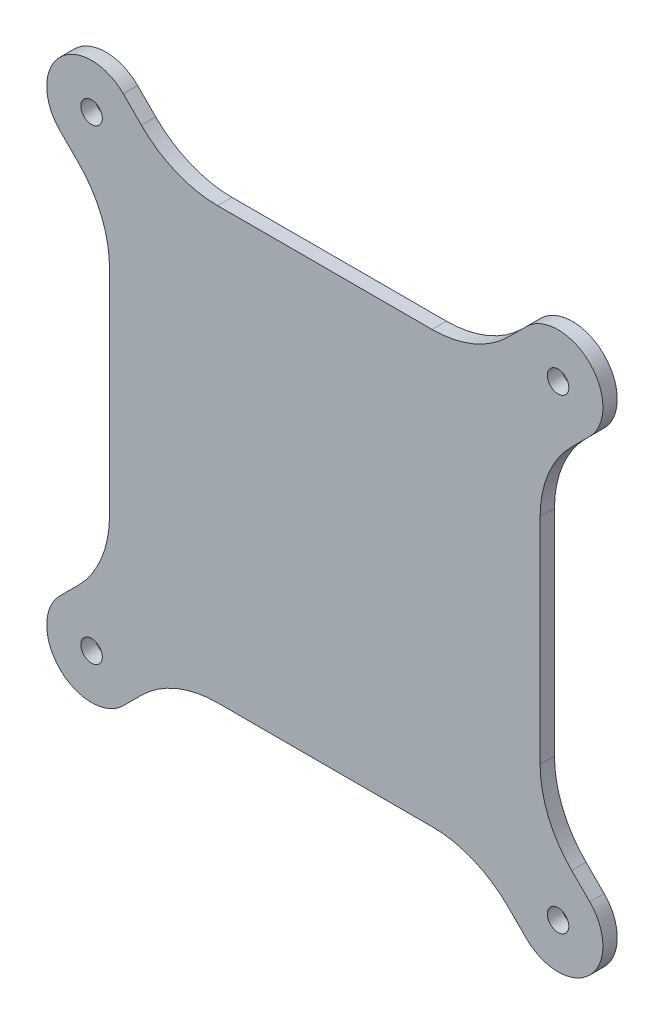
ISO-10303-21;
HEADER;
FILE_DESCRIPTION(('STEP AP214'),'2;1');
FILE_NAME('part.step','',(''),(''),'','','');
FILE_SCHEMA(('AUTOMOTIVE_DESIGN { 1 0 10303 214 1 1 1 1 }'));
ENDSEC;
DATA;
#1=APPLICATION_CONTEXT('core data for automotive mechanical design processes');
#2=APPLICATION_PROTOCOL_DEFINITION('international standard','automotive_design',2000,#1);
#3=PRODUCT_CONTEXT('',#1,'mechanical');
#4=PRODUCT('Part','Part','',(#3));
#5=PRODUCT_RELATED_PRODUCT_CATEGORY('part','',(#4));
#6=PRODUCT_DEFINITION_FORMATION('','',#4);
#7=PRODUCT_DEFINITION_CONTEXT('part definition',#1,'design');
#8=PRODUCT_DEFINITION('design','',#6,#7);
#9=PRODUCT_DEFINITION_SHAPE('','',#8);
#10=(LENGTH_UNIT() NAMED_UNIT(*) SI_UNIT(.MILLI.,.METRE.));
#11=(NAMED_UNIT(*) PLANE_ANGLE_UNIT() SI_UNIT($,.RADIAN.));
#12=(NAMED_UNIT(*) SI_UNIT($,.STERADIAN.) SOLID_ANGLE_UNIT());
#13=UNCERTAINTY_MEASURE_WITH_UNIT(LENGTH_MEASURE(1.E-05),#10,'distance_accuracy_value','');
#14=(GEOMETRIC_REPRESENTATION_CONTEXT(3) GLOBAL_UNCERTAINTY_ASSIGNED_CONTEXT((#13)) GLOBAL_UNIT_ASSIGNED_CONTEXT((#10,
#11,#12)) REPRESENTATION_CONTEXT('',''));
#15=CARTESIAN_POINT('',(0.,0.,0.));
#16=DIRECTION('',(0.,0.,1.));
#17=DIRECTION('',(1.,0.,0.));
#18=AXIS2_PLACEMENT_3D('',#15,#16,#17);
#19=CARTESIAN_POINT('',(0.,0.,0.));
#20=DIRECTION('',(0.,0.,1.));
#21=DIRECTION('',(1.,0.,0.));
#22=AXIS2_PLACEMENT_3D('',#19,#20,#21);
#23=PLANE('',#22);
#24=CARTESIAN_POINT('',(65.,65.,0.));
#25=DIRECTION('',(0.,0.,-1.));
#26=DIRECTION('',(1.,0.,0.));
#27=AXIS2_PLACEMENT_3D('',#24,#25,#26);
#28=CIRCLE('',#27,3.);
#29=CARTESIAN_POINT('',(62.,65.,0.));
#30=VERTEX_POINT('',#29);
#31=EDGE_CURVE('E474',#30,#30,#28,.T.);
#32=ORIENTED_EDGE('',*,*,#31,.F.);
#33=EDGE_LOOP('',(#32));
#34=FACE_BOUND('',#33,.T.);
#35=CARTESIAN_POINT('',(65.,-65.,0.));
#36=DIRECTION('',(0.,0.,-1.));
#37=DIRECTION('',(1.,0.,0.));
#38=AXIS2_PLACEMENT_3D('',#35,#36,#37);
#39=CIRCLE('',#38,3.);
#40=CARTESIAN_POINT('',(62.,-65.,0.));
#41=VERTEX_POINT('',#40);
#42=EDGE_CURVE('E19',#41,#41,#39,.T.);
#43=ORIENTED_EDGE('',*,*,#42,.F.);
#44=EDGE_LOOP('',(#43));
#45=FACE_BOUND('',#44,.T.);
#46=CARTESIAN_POINT('',(-65.,-65.,0.));
#47=DIRECTION('',(0.,0.,-1.));
#48=DIRECTION('',(1.,0.,0.));
#49=AXIS2_PLACEMENT_3D('',#46,#47,#48);
#50=CIRCLE('',#49,3.);
#51=CARTESIAN_POINT('',(-68.,-65.,0.));
#52=VERTEX_POINT('',#51);
#53=EDGE_CURVE('E310',#52,#52,#50,.T.);
#54=ORIENTED_EDGE('',*,*,#53,.F.);
#55=EDGE_LOOP('',(#54));
#56=FACE_BOUND('',#55,.T.);
#57=CARTESIAN_POINT('',(-65.,65.,0.));
#58=DIRECTION('',(0.,0.,-1.));
#59=DIRECTION('',(1.,0.,0.));
#60=AXIS2_PLACEMENT_3D('',#57,#58,#59);
#61=CIRCLE('',#60,3.);
#62=CARTESIAN_POINT('',(-68.,65.,0.));
#63=VERTEX_POINT('',#62);
#64=EDGE_CURVE('E459',#63,#63,#61,.T.);
#65=ORIENTED_EDGE('',*,*,#64,.F.);
#66=EDGE_LOOP('',(#65));
#67=FACE_BOUND('',#66,.T.);
#68=CARTESIAN_POINT('',(-65.,-65.,0.));
#69=DIRECTION('',(0.,0.,1.));
#70=DIRECTION('',(-0.707106781186548,0.707106781186548,0.));
#71=AXIS2_PLACEMENT_3D('',#68,#69,#70);
#72=CIRCLE('',#71,12.5);
#73=CARTESIAN_POINT('',(-73.8388347648318,-56.1611652351682,0.));
#74=VERTEX_POINT('',#73);
#75=CARTESIAN_POINT('',(-56.1611652351682,-73.8388347648318,0.));
#76=VERTEX_POINT('',#75);
#77=EDGE_CURVE('E26',#74,#76,#72,.T.);
#78=ORIENTED_EDGE('',*,*,#77,.F.);
#79=DIRECTION('',(0.707106781186548,0.707106781186548,0.));
#80=VECTOR('',#79,1.);
#81=CARTESIAN_POINT('',(-73.8388347648318,-56.1611652351682,0.));
#82=LINE('',#81,#80);
#83=CARTESIAN_POINT('',(-68.7867965644036,-51.1091270347399,0.));
#84=VERTEX_POINT('',#83);
#85=EDGE_CURVE('E346',#74,#84,#82,.T.);
#86=ORIENTED_EDGE('',*,*,#85,.T.);
#87=CARTESIAN_POINT('',(-90.,-29.8959235991434,0.));
#88=DIRECTION('',(0.,0.,1.));
#89=DIRECTION('',(0.707106781186548,-0.707106781186547,0.));
#90=AXIS2_PLACEMENT_3D('',#87,#88,#89);
#91=CIRCLE('',#90,30.);
#92=CARTESIAN_POINT('',(-60.,-29.8959235991435,0.));
#93=VERTEX_POINT('',#92);
#94=EDGE_CURVE('E335',#84,#93,#91,.T.);
#95=ORIENTED_EDGE('',*,*,#94,.T.);
#96=DIRECTION('',(0.,1.,0.));
#97=VECTOR('',#96,1.);
#98=CARTESIAN_POINT('',(-60.,-29.8959235991435,0.));
#99=LINE('',#98,#97);
#100=CARTESIAN_POINT('',(-60.,29.8959235991435,0.));
#101=VERTEX_POINT('',#100);
#102=EDGE_CURVE('E298',#93,#101,#99,.T.);
#103=ORIENTED_EDGE('',*,*,#102,.T.);
#104=CARTESIAN_POINT('',(-90.,29.8959235991434,0.));
#105=DIRECTION('',(0.,0.,1.));
#106=DIRECTION('',(1.,0.,0.));
#107=AXIS2_PLACEMENT_3D('',#104,#105,#106);
#108=CIRCLE('',#107,30.);
#109=CARTESIAN_POINT('',(-68.7867965644036,51.1091270347399,0.));
#110=VERTEX_POINT('',#109);
#111=EDGE_CURVE('E291',#101,#110,#108,.T.);
#112=ORIENTED_EDGE('',*,*,#111,.T.);
#113=DIRECTION('',(0.707106781186548,-0.707106781186548,0.));
#114=VECTOR('',#113,1.);
#115=CARTESIAN_POINT('',(-73.8388347648318,56.1611652351682,0.));
#116=LINE('',#115,#114);
#117=CARTESIAN_POINT('',(-73.8388347648318,56.1611652351682,0.));
#118=VERTEX_POINT('',#117);
#119=EDGE_CURVE('E281',#118,#110,#116,.T.);
#120=ORIENTED_EDGE('',*,*,#119,.F.);
#121=CARTESIAN_POINT('',(-65.,65.,0.));
#122=DIRECTION('',(0.,0.,1.));
#123=DIRECTION('',(0.707106781186548,0.707106781186547,0.));
#124=AXIS2_PLACEMENT_3D('',#121,#122,#123);
#125=CIRCLE('',#124,12.5);
#126=CARTESIAN_POINT('',(-56.1611652351682,73.8388347648318,0.));
#127=VERTEX_POINT('',#126);
#128=EDGE_CURVE('E297',#127,#118,#125,.T.);
#129=ORIENTED_EDGE('',*,*,#128,.F.);
#130=DIRECTION('',(0.707106781186548,-0.707106781186548,0.));
#131=VECTOR('',#130,1.);
#132=CARTESIAN_POINT('',(-56.1611652351682,73.8388347648318,0.));
#133=LINE('',#132,#131);
#134=CARTESIAN_POINT('',(-51.1091270347399,68.7867965644036,0.));
#135=VERTEX_POINT('',#134);
#136=EDGE_CURVE('E359',#127,#135,#133,.T.);
#137=ORIENTED_EDGE('',*,*,#136,.T.);
#138=CARTESIAN_POINT('',(-29.8959235991434,90.,0.));
#139=DIRECTION('',(0.,0.,1.));
#140=DIRECTION('',(-0.707106781186546,-0.707106781186549,0.));
#141=AXIS2_PLACEMENT_3D('',#138,#139,#140);
#142=CIRCLE('',#141,30.);
#143=CARTESIAN_POINT('',(-29.8959235991435,60.,0.));
#144=VERTEX_POINT('',#143);
#145=EDGE_CURVE('E245',#135,#144,#142,.T.);
#146=ORIENTED_EDGE('',*,*,#145,.T.);
#147=DIRECTION('',(1.,0.,0.));
#148=VECTOR('',#147,1.);
#149=CARTESIAN_POINT('',(-29.8959235991435,60.,0.));
#150=LINE('',#149,#148);
#151=CARTESIAN_POINT('',(29.8959235991435,60.,0.));
#152=VERTEX_POINT('',#151);
#153=EDGE_CURVE('E230',#144,#152,#150,.T.);
#154=ORIENTED_EDGE('',*,*,#153,.T.);
#155=CARTESIAN_POINT('',(29.8959235991434,90.,0.));
#156=DIRECTION('',(0.,0.,1.));
#157=DIRECTION('',(0.,-1.,0.));
#158=AXIS2_PLACEMENT_3D('',#155,#156,#157);
#159=CIRCLE('',#158,30.);
#160=CARTESIAN_POINT('',(51.1091270347399,68.7867965644036,0.));
#161=VERTEX_POINT('',#160);
#162=EDGE_CURVE('E261',#152,#161,#159,.T.);
#163=ORIENTED_EDGE('',*,*,#162,.T.);
#164=DIRECTION('',(-0.707106781186548,-0.707106781186548,0.));
#165=VECTOR('',#164,1.);
#166=CARTESIAN_POINT('',(56.1611652351682,73.8388347648318,0.));
#167=LINE('',#166,#165);
#168=CARTESIAN_POINT('',(56.1611652351682,73.8388347648318,0.));
#169=VERTEX_POINT('',#168);
#170=EDGE_CURVE('E304',#169,#161,#167,.T.);
#171=ORIENTED_EDGE('',*,*,#170,.F.);
#172=CARTESIAN_POINT('',(65.,65.,0.));
#173=DIRECTION('',(0.,0.,1.));
#174=DIRECTION('',(0.707106781186548,-0.707106781186548,0.));
#175=AXIS2_PLACEMENT_3D('',#172,#173,#174);
#176=CIRCLE('',#175,12.5);
#177=CARTESIAN_POINT('',(73.8388347648318,56.1611652351682,0.));
#178=VERTEX_POINT('',#177);
#179=EDGE_CURVE('E260',#178,#169,#176,.T.);
#180=ORIENTED_EDGE('',*,*,#179,.F.);
#181=DIRECTION('',(-0.707106781186548,-0.707106781186548,0.));
#182=VECTOR('',#181,1.);
#183=CARTESIAN_POINT('',(73.8388347648318,56.1611652351682,0.));
#184=LINE('',#183,#182);
#185=CARTESIAN_POINT('',(68.7867965644036,51.1091270347399,0.));
#186=VERTEX_POINT('',#185);
#187=EDGE_CURVE('E355',#178,#186,#184,.T.);
#188=ORIENTED_EDGE('',*,*,#187,.T.);
#189=CARTESIAN_POINT('',(90.,29.8959235991434,0.));
#190=DIRECTION('',(0.,0.,1.));
#191=DIRECTION('',(-0.707106781186548,0.707106781186547,0.));
#192=AXIS2_PLACEMENT_3D('',#189,#190,#191);
#193=CIRCLE('',#192,30.);
#194=CARTESIAN_POINT('',(60.,29.8959235991435,0.));
#195=VERTEX_POINT('',#194);
#196=EDGE_CURVE('E320',#186,#195,#193,.T.);
#197=ORIENTED_EDGE('',*,*,#196,.T.);
#198=DIRECTION('',(0.,-1.,0.));
#199=VECTOR('',#198,1.);
#200=CARTESIAN_POINT('',(60.,29.8959235991435,0.));
#201=LINE('',#200,#199);
#202=CARTESIAN_POINT('',(60.,-29.8959235991435,0.));
#203=VERTEX_POINT('',#202);
#204=EDGE_CURVE('E386',#195,#203,#201,.T.);
#205=ORIENTED_EDGE('',*,*,#204,.T.);
#206=CARTESIAN_POINT('',(90.,-29.8959235991434,0.));
#207=DIRECTION('',(0.,0.,1.));
#208=DIRECTION('',(-1.,0.,0.));
#209=AXIS2_PLACEMENT_3D('',#206,#207,#208);
#210=CIRCLE('',#209,30.);
#211=CARTESIAN_POINT('',(68.7867965644036,-51.1091270347399,0.));
#212=VERTEX_POINT('',#211);
#213=EDGE_CURVE('E286',#203,#212,#210,.T.);
#214=ORIENTED_EDGE('',*,*,#213,.T.);
#215=DIRECTION('',(-0.707106781186548,0.707106781186548,0.));
#216=VECTOR('',#215,1.);
#217=CARTESIAN_POINT('',(73.8388347648318,-56.1611652351682,0.));
#218=LINE('',#217,#216);
#219=CARTESIAN_POINT('',(73.8388347648318,-56.1611652351682,0.));
#220=VERTEX_POINT('',#219);
#221=EDGE_CURVE('E270',#220,#212,#218,.T.);
#222=ORIENTED_EDGE('',*,*,#221,.F.);
#223=CARTESIAN_POINT('',(65.,-65.,0.));
#224=DIRECTION('',(0.,0.,1.));
#225=DIRECTION('',(-0.707106781186548,-0.707106781186547,0.));
#226=AXIS2_PLACEMENT_3D('',#223,#224,#225);
#227=CIRCLE('',#226,12.5);
#228=CARTESIAN_POINT('',(56.1611652351682,-73.8388347648318,0.));
#229=VERTEX_POINT('',#228);
#230=EDGE_CURVE('E276',#229,#220,#227,.T.);
#231=ORIENTED_EDGE('',*,*,#230,.F.);
#232=DIRECTION('',(-0.707106781186548,0.707106781186548,0.));
#233=VECTOR('',#232,1.);
#234=CARTESIAN_POINT('',(56.1611652351682,-73.8388347648318,0.));
#235=LINE('',#234,#233);
#236=CARTESIAN_POINT('',(51.1091270347399,-68.7867965644036,0.));
#237=VERTEX_POINT('',#236);
#238=EDGE_CURVE('E368',#229,#237,#235,.T.);
#239=ORIENTED_EDGE('',*,*,#238,.T.);
#240=CARTESIAN_POINT('',(29.8959235991434,-90.,0.));
#241=DIRECTION('',(0.,0.,1.));
#242=DIRECTION('',(0.707106781186546,0.707106781186549,0.));
#243=AXIS2_PLACEMENT_3D('',#240,#241,#242);
#244=CIRCLE('',#243,30.);
#245=CARTESIAN_POINT('',(29.8959235991435,-60.,0.));
#246=VERTEX_POINT('',#245);
#247=EDGE_CURVE('E364',#237,#246,#244,.T.);
#248=ORIENTED_EDGE('',*,*,#247,.T.);
#249=DIRECTION('',(-1.,0.,0.));
#250=VECTOR('',#249,1.);
#251=CARTESIAN_POINT('',(29.8959235991435,-60.,0.));
#252=LINE('',#251,#250);
#253=CARTESIAN_POINT('',(-29.8959235991435,-60.,0.));
#254=VERTEX_POINT('',#253);
#255=EDGE_CURVE('E418',#246,#254,#252,.T.);
#256=ORIENTED_EDGE('',*,*,#255,.T.);
#257=CARTESIAN_POINT('',(-29.8959235991434,-90.,0.));
#258=DIRECTION('',(0.,0.,1.));
#259=DIRECTION('',(0.,1.,0.));
#260=AXIS2_PLACEMENT_3D('',#257,#258,#259);
#261=CIRCLE('',#260,30.);
#262=CARTESIAN_POINT('',(-51.1091270347399,-68.7867965644036,0.));
#263=VERTEX_POINT('',#262);
#264=EDGE_CURVE('E330',#254,#263,#261,.T.);
#265=ORIENTED_EDGE('',*,*,#264,.T.);
#266=DIRECTION('',(0.707106781186548,0.707106781186548,0.));
#267=VECTOR('',#266,1.);
#268=CARTESIAN_POINT('',(-56.1611652351682,-73.8388347648318,0.));
#269=LINE('',#268,#267);
#270=EDGE_CURVE('E393',#76,#263,#269,.T.);
#271=ORIENTED_EDGE('',*,*,#270,.F.);
#272=EDGE_LOOP('',(#78,#86,#95,#103,#112,#120,#129,#137,#146,#154,#163,#171,#180,#188,#197,#205,
#214,#222,#231,#239,#248,#256,#265,#271));
#273=FACE_BOUND('',#272,.T.);
#274=ADVANCED_FACE('F15',(#34,#45,#56,#67,#273),#23,.F.);
#275=CARTESIAN_POINT('',(0.,0.,4.));
#276=DIRECTION('',(0.,0.,1.));
#277=DIRECTION('',(1.,0.,0.));
#278=AXIS2_PLACEMENT_3D('',#275,#276,#277);
#279=PLANE('',#278);
#280=CARTESIAN_POINT('',(65.,65.,4.));
#281=DIRECTION('',(0.,0.,-1.));
#282=DIRECTION('',(1.,0.,0.));
#283=AXIS2_PLACEMENT_3D('',#280,#281,#282);
#284=CIRCLE('',#283,3.);
#285=CARTESIAN_POINT('',(62.,65.,4.));
#286=VERTEX_POINT('',#285);
#287=EDGE_CURVE('E500',#286,#286,#284,.T.);
#288=ORIENTED_EDGE('',*,*,#287,.T.);
#289=EDGE_LOOP('',(#288));
#290=FACE_BOUND('',#289,.T.);
#291=CARTESIAN_POINT('',(65.,-65.,4.));
#292=DIRECTION('',(0.,0.,-1.));
#293=DIRECTION('',(1.,0.,0.));
#294=AXIS2_PLACEMENT_3D('',#291,#292,#293);
#295=CIRCLE('',#294,3.);
#296=CARTESIAN_POINT('',(62.,-65.,4.));
#297=VERTEX_POINT('',#296);
#298=EDGE_CURVE('E470',#297,#297,#295,.T.);
#299=ORIENTED_EDGE('',*,*,#298,.T.);
#300=EDGE_LOOP('',(#299));
#301=FACE_BOUND('',#300,.T.);
#302=CARTESIAN_POINT('',(-65.,-65.,4.));
#303=DIRECTION('',(0.,0.,-1.));
#304=DIRECTION('',(1.,0.,0.));
#305=AXIS2_PLACEMENT_3D('',#302,#303,#304);
#306=CIRCLE('',#305,3.);
#307=CARTESIAN_POINT('',(-68.,-65.,4.));
#308=VERTEX_POINT('',#307);
#309=EDGE_CURVE('E339',#308,#308,#306,.T.);
#310=ORIENTED_EDGE('',*,*,#309,.T.);
#311=EDGE_LOOP('',(#310));
#312=FACE_BOUND('',#311,.T.);
#313=CARTESIAN_POINT('',(-65.,65.,4.));
#314=DIRECTION('',(0.,0.,-1.));
#315=DIRECTION('',(1.,0.,0.));
#316=AXIS2_PLACEMENT_3D('',#313,#314,#315);
#317=CIRCLE('',#316,3.);
#318=CARTESIAN_POINT('',(-68.,65.,4.));
#319=VERTEX_POINT('',#318);
#320=EDGE_CURVE('E313',#319,#319,#317,.T.);
#321=ORIENTED_EDGE('',*,*,#320,.T.);
#322=EDGE_LOOP('',(#321));
#323=FACE_BOUND('',#322,.T.);
#324=CARTESIAN_POINT('',(-65.,-65.,4.));
#325=DIRECTION('',(0.,0.,1.));
#326=DIRECTION('',(-0.707106781186548,0.707106781186548,0.));
#327=AXIS2_PLACEMENT_3D('',#324,#325,#326);
#328=CIRCLE('',#327,12.5);
#329=CARTESIAN_POINT('',(-73.8388347648318,-56.1611652351682,4.));
#330=VERTEX_POINT('',#329);
#331=CARTESIAN_POINT('',(-56.1611652351682,-73.8388347648318,4.));
#332=VERTEX_POINT('',#331);
#333=EDGE_CURVE('E10',#330,#332,#328,.T.);
#334=ORIENTED_EDGE('',*,*,#333,.T.);
#335=DIRECTION('',(0.707106781186548,0.707106781186548,0.));
#336=VECTOR('',#335,1.);
#337=CARTESIAN_POINT('',(-56.1611652351682,-73.8388347648318,4.));
#338=LINE('',#337,#336);
#339=CARTESIAN_POINT('',(-51.1091270347399,-68.7867965644036,4.));
#340=VERTEX_POINT('',#339);
#341=EDGE_CURVE('E395',#332,#340,#338,.T.);
#342=ORIENTED_EDGE('',*,*,#341,.T.);
#343=CARTESIAN_POINT('',(-29.8959235991434,-90.,4.));
#344=DIRECTION('',(0.,0.,-1.));
#345=DIRECTION('',(0.,1.,0.));
#346=AXIS2_PLACEMENT_3D('',#343,#344,#345);
#347=CIRCLE('',#346,30.);
#348=CARTESIAN_POINT('',(-29.8959235991435,-60.,4.));
#349=VERTEX_POINT('',#348);
#350=EDGE_CURVE('E326',#340,#349,#347,.T.);
#351=ORIENTED_EDGE('',*,*,#350,.T.);
#352=DIRECTION('',(1.,0.,0.));
#353=VECTOR('',#352,1.);
#354=CARTESIAN_POINT('',(29.8959235991435,-60.,4.));
#355=LINE('',#354,#353);
#356=CARTESIAN_POINT('',(29.8959235991435,-60.,4.));
#357=VERTEX_POINT('',#356);
#358=EDGE_CURVE('E415',#349,#357,#355,.T.);
#359=ORIENTED_EDGE('',*,*,#358,.T.);
#360=CARTESIAN_POINT('',(29.8959235991434,-90.,4.));
#361=DIRECTION('',(0.,0.,-1.));
#362=DIRECTION('',(0.707106781186546,0.707106781186549,0.));
#363=AXIS2_PLACEMENT_3D('',#360,#361,#362);
#364=CIRCLE('',#363,30.);
#365=CARTESIAN_POINT('',(51.1091270347399,-68.7867965644036,4.));
#366=VERTEX_POINT('',#365);
#367=EDGE_CURVE('E360',#357,#366,#364,.T.);
#368=ORIENTED_EDGE('',*,*,#367,.T.);
#369=DIRECTION('',(0.707106781186548,-0.707106781186548,0.));
#370=VECTOR('',#369,1.);
#371=CARTESIAN_POINT('',(56.1611652351682,-73.8388347648318,4.));
#372=LINE('',#371,#370);
#373=CARTESIAN_POINT('',(56.1611652351682,-73.8388347648318,4.));
#374=VERTEX_POINT('',#373);
#375=EDGE_CURVE('E398',#366,#374,#372,.T.);
#376=ORIENTED_EDGE('',*,*,#375,.T.);
#377=CARTESIAN_POINT('',(65.,-65.,4.));
#378=DIRECTION('',(0.,0.,1.));
#379=DIRECTION('',(-0.707106781186548,-0.707106781186547,0.));
#380=AXIS2_PLACEMENT_3D('',#377,#378,#379);
#381=CIRCLE('',#380,12.5);
#382=CARTESIAN_POINT('',(73.8388347648319,-56.1611652351682,4.));
#383=VERTEX_POINT('',#382);
#384=EDGE_CURVE('E271',#374,#383,#381,.T.);
#385=ORIENTED_EDGE('',*,*,#384,.T.);
#386=DIRECTION('',(-0.707106781186548,0.707106781186548,0.));
#387=VECTOR('',#386,1.);
#388=CARTESIAN_POINT('',(73.8388347648318,-56.1611652351682,4.));
#389=LINE('',#388,#387);
#390=CARTESIAN_POINT('',(68.7867965644036,-51.1091270347399,4.));
#391=VERTEX_POINT('',#390);
#392=EDGE_CURVE('E265',#383,#391,#389,.T.);
#393=ORIENTED_EDGE('',*,*,#392,.T.);
#394=CARTESIAN_POINT('',(90.,-29.8959235991434,4.));
#395=DIRECTION('',(0.,0.,-1.));
#396=DIRECTION('',(-1.,0.,0.));
#397=AXIS2_PLACEMENT_3D('',#394,#395,#396);
#398=CIRCLE('',#397,30.);
#399=CARTESIAN_POINT('',(60.,-29.8959235991435,4.));
#400=VERTEX_POINT('',#399);
#401=EDGE_CURVE('E282',#391,#400,#398,.T.);
#402=ORIENTED_EDGE('',*,*,#401,.T.);
#403=DIRECTION('',(0.,1.,0.));
#404=VECTOR('',#403,1.);
#405=CARTESIAN_POINT('',(60.,29.8959235991435,4.));
#406=LINE('',#405,#404);
#407=CARTESIAN_POINT('',(60.,29.8959235991435,4.));
#408=VERTEX_POINT('',#407);
#409=EDGE_CURVE('E351',#400,#408,#406,.T.);
#410=ORIENTED_EDGE('',*,*,#409,.T.);
#411=CARTESIAN_POINT('',(90.,29.8959235991434,4.));
#412=DIRECTION('',(0.,0.,-1.));
#413=DIRECTION('',(-0.707106781186548,0.707106781186547,0.));
#414=AXIS2_PLACEMENT_3D('',#411,#412,#413);
#415=CIRCLE('',#414,30.);
#416=CARTESIAN_POINT('',(68.7867965644036,51.1091270347399,4.));
#417=VERTEX_POINT('',#416);
#418=EDGE_CURVE('E324',#408,#417,#415,.T.);
#419=ORIENTED_EDGE('',*,*,#418,.T.);
#420=DIRECTION('',(0.707106781186548,0.707106781186548,0.));
#421=VECTOR('',#420,1.);
#422=CARTESIAN_POINT('',(73.8388347648318,56.1611652351682,4.));
#423=LINE('',#422,#421);
#424=CARTESIAN_POINT('',(73.8388347648319,56.1611652351682,4.));
#425=VERTEX_POINT('',#424);
#426=EDGE_CURVE('E387',#417,#425,#423,.T.);
#427=ORIENTED_EDGE('',*,*,#426,.T.);
#428=CARTESIAN_POINT('',(65.,65.,4.));
#429=DIRECTION('',(0.,0.,1.));
#430=DIRECTION('',(0.707106781186548,-0.707106781186548,0.));
#431=AXIS2_PLACEMENT_3D('',#428,#429,#430);
#432=CIRCLE('',#431,12.5);
#433=CARTESIAN_POINT('',(56.1611652351682,73.8388347648318,4.));
#434=VERTEX_POINT('',#433);
#435=EDGE_CURVE('E256',#425,#434,#432,.T.);
#436=ORIENTED_EDGE('',*,*,#435,.T.);
#437=DIRECTION('',(-0.707106781186548,-0.707106781186548,0.));
#438=VECTOR('',#437,1.);
#439=CARTESIAN_POINT('',(56.1611652351682,73.8388347648318,4.));
#440=LINE('',#439,#438);
#441=CARTESIAN_POINT('',(51.1091270347399,68.7867965644036,4.));
#442=VERTEX_POINT('',#441);
#443=EDGE_CURVE('E308',#434,#442,#440,.T.);
#444=ORIENTED_EDGE('',*,*,#443,.T.);
#445=CARTESIAN_POINT('',(29.8959235991434,90.,4.));
#446=DIRECTION('',(0.,0.,-1.));
#447=DIRECTION('',(0.,-1.,0.));
#448=AXIS2_PLACEMENT_3D('',#445,#446,#447);
#449=CIRCLE('',#448,30.);
#450=CARTESIAN_POINT('',(29.8959235991435,60.,4.));
#451=VERTEX_POINT('',#450);
#452=EDGE_CURVE('E224',#442,#451,#449,.T.);
#453=ORIENTED_EDGE('',*,*,#452,.T.);
#454=DIRECTION('',(-1.,0.,0.));
#455=VECTOR('',#454,1.);
#456=CARTESIAN_POINT('',(-29.8959235991435,60.,4.));
#457=LINE('',#456,#455);
#458=CARTESIAN_POINT('',(-29.8959235991435,60.,4.));
#459=VERTEX_POINT('',#458);
#460=EDGE_CURVE('E216',#451,#459,#457,.T.);
#461=ORIENTED_EDGE('',*,*,#460,.T.);
#462=CARTESIAN_POINT('',(-29.8959235991434,90.,4.));
#463=DIRECTION('',(0.,0.,-1.));
#464=DIRECTION('',(-0.707106781186546,-0.707106781186549,0.));
#465=AXIS2_PLACEMENT_3D('',#462,#463,#464);
#466=CIRCLE('',#465,30.);
#467=CARTESIAN_POINT('',(-51.1091270347399,68.7867965644036,4.));
#468=VERTEX_POINT('',#467);
#469=EDGE_CURVE('E220',#459,#468,#466,.T.);
#470=ORIENTED_EDGE('',*,*,#469,.T.);
#471=DIRECTION('',(-0.707106781186548,0.707106781186548,0.));
#472=VECTOR('',#471,1.);
#473=CARTESIAN_POINT('',(-56.1611652351682,73.8388347648318,4.));
#474=LINE('',#473,#472);
#475=CARTESIAN_POINT('',(-56.1611652351682,73.8388347648318,4.));
#476=VERTEX_POINT('',#475);
#477=EDGE_CURVE('E356',#468,#476,#474,.T.);
#478=ORIENTED_EDGE('',*,*,#477,.T.);
#479=CARTESIAN_POINT('',(-65.,65.,4.));
#480=DIRECTION('',(0.,0.,1.));
#481=DIRECTION('',(0.707106781186548,0.707106781186547,0.));
#482=AXIS2_PLACEMENT_3D('',#479,#480,#481);
#483=CIRCLE('',#482,12.5);
#484=CARTESIAN_POINT('',(-73.8388347648318,56.1611652351682,4.));
#485=VERTEX_POINT('',#484);
#486=EDGE_CURVE('E292',#476,#485,#483,.T.);
#487=ORIENTED_EDGE('',*,*,#486,.T.);
#488=DIRECTION('',(0.707106781186548,-0.707106781186548,0.));
#489=VECTOR('',#488,1.);
#490=CARTESIAN_POINT('',(-73.8388347648318,56.1611652351682,4.));
#491=LINE('',#490,#489);
#492=CARTESIAN_POINT('',(-68.7867965644036,51.1091270347399,4.));
#493=VERTEX_POINT('',#492);
#494=EDGE_CURVE('E277',#485,#493,#491,.T.);
#495=ORIENTED_EDGE('',*,*,#494,.T.);
#496=CARTESIAN_POINT('',(-90.,29.8959235991434,4.));
#497=DIRECTION('',(0.,0.,-1.));
#498=DIRECTION('',(1.,0.,0.));
#499=AXIS2_PLACEMENT_3D('',#496,#497,#498);
#500=CIRCLE('',#499,30.);
#501=CARTESIAN_POINT('',(-60.,29.8959235991435,4.));
#502=VERTEX_POINT('',#501);
#503=EDGE_CURVE('E287',#493,#502,#500,.T.);
#504=ORIENTED_EDGE('',*,*,#503,.T.);
#505=DIRECTION('',(0.,-1.,0.));
#506=VECTOR('',#505,1.);
#507=CARTESIAN_POINT('',(-60.,-29.8959235991435,4.));
#508=LINE('',#507,#506);
#509=CARTESIAN_POINT('',(-60.,-29.8959235991435,4.));
#510=VERTEX_POINT('',#509);
#511=EDGE_CURVE('E302',#502,#510,#508,.T.);
#512=ORIENTED_EDGE('',*,*,#511,.T.);
#513=CARTESIAN_POINT('',(-90.,-29.8959235991434,4.));
#514=DIRECTION('',(0.,0.,-1.));
#515=DIRECTION('',(0.707106781186548,-0.707106781186547,0.));
#516=AXIS2_PLACEMENT_3D('',#513,#514,#515);
#517=CIRCLE('',#516,30.);
#518=CARTESIAN_POINT('',(-68.7867965644036,-51.1091270347399,4.));
#519=VERTEX_POINT('',#518);
#520=EDGE_CURVE('E332',#510,#519,#517,.T.);
#521=ORIENTED_EDGE('',*,*,#520,.T.);
#522=DIRECTION('',(-0.707106781186548,-0.707106781186548,0.));
#523=VECTOR('',#522,1.);
#524=CARTESIAN_POINT('',(-73.8388347648318,-56.1611652351682,4.));
#525=LINE('',#524,#523);
#526=EDGE_CURVE('E315',#519,#330,#525,.T.);
#527=ORIENTED_EDGE('',*,*,#526,.T.);
#528=EDGE_LOOP('',(#334,#342,#351,#359,#368,#376,#385,#393,#402,#410,#419,#427,#436,#444,#453,
#461,#470,#478,#487,#495,#504,#512,#521,#527));
#529=FACE_BOUND('',#528,.T.);
#530=ADVANCED_FACE('F218',(#290,#301,#312,#323,#529),#279,.T.);
#531=CARTESIAN_POINT('',(-65.,-65.,0.));
#532=DIRECTION('',(0.,0.,1.));
#533=DIRECTION('',(-0.707106781186548,0.707106781186548,0.));
#534=AXIS2_PLACEMENT_3D('',#531,#532,#533);
#535=CYLINDRICAL_SURFACE('',#534,12.5);
#536=ORIENTED_EDGE('',*,*,#77,.T.);
#537=DIRECTION('',(0.,0.,1.));
#538=VECTOR('',#537,1.);
#539=CARTESIAN_POINT('',(-56.1611652351682,-73.8388347648318,0.));
#540=LINE('',#539,#538);
#541=EDGE_CURVE('E421',#76,#332,#540,.T.);
#542=ORIENTED_EDGE('',*,*,#541,.T.);
#543=ORIENTED_EDGE('',*,*,#333,.F.);
#544=DIRECTION('',(0.,0.,1.));
#545=VECTOR('',#544,1.);
#546=CARTESIAN_POINT('',(-73.8388347648318,-56.1611652351682,0.));
#547=LINE('',#546,#545);
#548=EDGE_CURVE('E319',#74,#330,#547,.T.);
#549=ORIENTED_EDGE('',*,*,#548,.F.);
#550=EDGE_LOOP('',(#536,#542,#543,#549));
#551=FACE_BOUND('',#550,.T.);
#552=ADVANCED_FACE('F813',(#551),#535,.T.);
#553=CARTESIAN_POINT('',(-56.1611652351682,-73.8388347648318,0.));
#554=DIRECTION('',(0.707106781186548,-0.707106781186548,0.));
#555=DIRECTION('',(0.,0.,-1.));
#556=AXIS2_PLACEMENT_3D('',#553,#554,#555);
#557=PLANE('',#556);
#558=ORIENTED_EDGE('',*,*,#270,.T.);
#559=DIRECTION('',(0.,0.,1.));
#560=VECTOR('',#559,1.);
#561=CARTESIAN_POINT('',(-51.1091270347399,-68.7867965644036,0.));
#562=LINE('',#561,#560);
#563=EDGE_CURVE('E329',#263,#340,#562,.T.);
#564=ORIENTED_EDGE('',*,*,#563,.T.);
#565=ORIENTED_EDGE('',*,*,#341,.F.);
#566=ORIENTED_EDGE('',*,*,#541,.F.);
#567=EDGE_LOOP('',(#558,#564,#565,#566));
#568=FACE_BOUND('',#567,.T.);
#569=ADVANCED_FACE('F853',(#568),#557,.T.);
#570=CARTESIAN_POINT('',(-29.8959235991434,-90.,0.));
#571=DIRECTION('',(0.,0.,1.));
#572=DIRECTION('',(0.,1.,0.));
#573=AXIS2_PLACEMENT_3D('',#570,#571,#572);
#574=CYLINDRICAL_SURFACE('',#573,30.);
#575=ORIENTED_EDGE('',*,*,#264,.F.);
#576=DIRECTION('',(0.,0.,1.));
#577=VECTOR('',#576,1.);
#578=CARTESIAN_POINT('',(-29.8959235991435,-60.,0.));
#579=LINE('',#578,#577);
#580=EDGE_CURVE('E372',#254,#349,#579,.T.);
#581=ORIENTED_EDGE('',*,*,#580,.T.);
#582=ORIENTED_EDGE('',*,*,#350,.F.);
#583=ORIENTED_EDGE('',*,*,#563,.F.);
#584=EDGE_LOOP('',(#575,#581,#582,#583));
#585=FACE_BOUND('',#584,.T.);
#586=ADVANCED_FACE('F848',(#585),#574,.F.);
#587=CARTESIAN_POINT('',(-29.8959235991435,-60.,0.));
#588=DIRECTION('',(0.,-1.,0.));
#589=DIRECTION('',(0.,0.,-1.));
#590=AXIS2_PLACEMENT_3D('',#587,#588,#589);
#591=PLANE('',#590);
#592=ORIENTED_EDGE('',*,*,#255,.F.);
#593=DIRECTION('',(0.,0.,1.));
#594=VECTOR('',#593,1.);
#595=CARTESIAN_POINT('',(29.8959235991435,-60.,0.));
#596=LINE('',#595,#594);
#597=EDGE_CURVE('E363',#246,#357,#596,.T.);
#598=ORIENTED_EDGE('',*,*,#597,.T.);
#599=ORIENTED_EDGE('',*,*,#358,.F.);
#600=ORIENTED_EDGE('',*,*,#580,.F.);
#601=EDGE_LOOP('',(#592,#598,#599,#600));
#602=FACE_BOUND('',#601,.T.);
#603=ADVANCED_FACE('F852',(#602),#591,.T.);
#604=CARTESIAN_POINT('',(29.8959235991434,-90.,0.));
#605=DIRECTION('',(0.,0.,1.));
#606=DIRECTION('',(0.707106781186546,0.707106781186549,0.));
#607=AXIS2_PLACEMENT_3D('',#604,#605,#606);
#608=CYLINDRICAL_SURFACE('',#607,30.);
#609=ORIENTED_EDGE('',*,*,#247,.F.);
#610=DIRECTION('',(0.,0.,1.));
#611=VECTOR('',#610,1.);
#612=CARTESIAN_POINT('',(51.1091270347399,-68.7867965644036,0.));
#613=LINE('',#612,#611);
#614=EDGE_CURVE('E381',#237,#366,#613,.T.);
#615=ORIENTED_EDGE('',*,*,#614,.T.);
#616=ORIENTED_EDGE('',*,*,#367,.F.);
#617=ORIENTED_EDGE('',*,*,#597,.F.);
#618=EDGE_LOOP('',(#609,#615,#616,#617));
#619=FACE_BOUND('',#618,.T.);
#620=ADVANCED_FACE('F945',(#619),#608,.F.);
#621=CARTESIAN_POINT('',(51.1091270347399,-68.7867965644036,0.));
#622=DIRECTION('',(-0.707106781186548,-0.707106781186548,0.));
#623=DIRECTION('',(-0.707106781186548,0.707106781186548,0.));
#624=AXIS2_PLACEMENT_3D('',#621,#622,#623);
#625=PLANE('',#624);
#626=ORIENTED_EDGE('',*,*,#238,.F.);
#627=DIRECTION('',(0.,0.,1.));
#628=VECTOR('',#627,1.);
#629=CARTESIAN_POINT('',(56.1611652351682,-73.8388347648318,0.));
#630=LINE('',#629,#628);
#631=EDGE_CURVE('E275',#229,#374,#630,.T.);
#632=ORIENTED_EDGE('',*,*,#631,.T.);
#633=ORIENTED_EDGE('',*,*,#375,.F.);
#634=ORIENTED_EDGE('',*,*,#614,.F.);
#635=EDGE_LOOP('',(#626,#632,#633,#634));
#636=FACE_BOUND('',#635,.T.);
#637=ADVANCED_FACE('F962',(#636),#625,.T.);
#638=CARTESIAN_POINT('',(65.,-65.,0.));
#639=DIRECTION('',(0.,0.,1.));
#640=DIRECTION('',(-0.707106781186548,-0.707106781186547,0.));
#641=AXIS2_PLACEMENT_3D('',#638,#639,#640);
#642=CYLINDRICAL_SURFACE('',#641,12.5);
#643=ORIENTED_EDGE('',*,*,#230,.T.);
#644=DIRECTION('',(0.,0.,1.));
#645=VECTOR('',#644,1.);
#646=CARTESIAN_POINT('',(73.8388347648318,-56.1611652351682,0.));
#647=LINE('',#646,#645);
#648=EDGE_CURVE('E269',#220,#383,#647,.T.);
#649=ORIENTED_EDGE('',*,*,#648,.T.);
#650=ORIENTED_EDGE('',*,*,#384,.F.);
#651=ORIENTED_EDGE('',*,*,#631,.F.);
#652=EDGE_LOOP('',(#643,#649,#650,#651));
#653=FACE_BOUND('',#652,.T.);
#654=ADVANCED_FACE('F912',(#653),#642,.T.);
#655=CARTESIAN_POINT('',(73.8388347648318,-56.1611652351682,0.));
#656=DIRECTION('',(0.707106781186548,0.707106781186548,0.));
#657=DIRECTION('',(0.,0.,-1.));
#658=AXIS2_PLACEMENT_3D('',#655,#656,#657);
#659=PLANE('',#658);
#660=ORIENTED_EDGE('',*,*,#221,.T.);
#661=DIRECTION('',(0.,0.,1.));
#662=VECTOR('',#661,1.);
#663=CARTESIAN_POINT('',(68.7867965644036,-51.1091270347399,0.));
#664=LINE('',#663,#662);
#665=EDGE_CURVE('E285',#212,#391,#664,.T.);
#666=ORIENTED_EDGE('',*,*,#665,.T.);
#667=ORIENTED_EDGE('',*,*,#392,.F.);
#668=ORIENTED_EDGE('',*,*,#648,.F.);
#669=EDGE_LOOP('',(#660,#666,#667,#668));
#670=FACE_BOUND('',#669,.T.);
#671=ADVANCED_FACE('F560',(#670),#659,.T.);
#672=CARTESIAN_POINT('',(90.,-29.8959235991434,0.));
#673=DIRECTION('',(0.,0.,1.));
#674=DIRECTION('',(-1.,0.,0.));
#675=AXIS2_PLACEMENT_3D('',#672,#673,#674);
#676=CYLINDRICAL_SURFACE('',#675,30.);
#677=ORIENTED_EDGE('',*,*,#213,.F.);
#678=DIRECTION('',(0.,0.,1.));
#679=VECTOR('',#678,1.);
#680=CARTESIAN_POINT('',(60.,-29.8959235991435,0.));
#681=LINE('',#680,#679);
#682=EDGE_CURVE('E347',#203,#400,#681,.T.);
#683=ORIENTED_EDGE('',*,*,#682,.T.);
#684=ORIENTED_EDGE('',*,*,#401,.F.);
#685=ORIENTED_EDGE('',*,*,#665,.F.);
#686=EDGE_LOOP('',(#677,#683,#684,#685));
#687=FACE_BOUND('',#686,.T.);
#688=ADVANCED_FACE('F566',(#687),#676,.F.);
#689=CARTESIAN_POINT('',(60.,-29.8959235991435,0.));
#690=DIRECTION('',(1.,0.,0.));
#691=DIRECTION('',(0.,1.,0.));
#692=AXIS2_PLACEMENT_3D('',#689,#690,#691);
#693=PLANE('',#692);
#694=ORIENTED_EDGE('',*,*,#204,.F.);
#695=DIRECTION('',(0.,0.,1.));
#696=VECTOR('',#695,1.);
#697=CARTESIAN_POINT('',(60.,29.8959235991435,0.));
#698=LINE('',#697,#696);
#699=EDGE_CURVE('E382',#195,#408,#698,.T.);
#700=ORIENTED_EDGE('',*,*,#699,.T.);
#701=ORIENTED_EDGE('',*,*,#409,.F.);
#702=ORIENTED_EDGE('',*,*,#682,.F.);
#703=EDGE_LOOP('',(#694,#700,#701,#702));
#704=FACE_BOUND('',#703,.T.);
#705=ADVANCED_FACE('F904',(#704),#693,.T.);
#706=CARTESIAN_POINT('',(90.,29.8959235991434,0.));
#707=DIRECTION('',(0.,0.,1.));
#708=DIRECTION('',(-0.707106781186548,0.707106781186547,0.));
#709=AXIS2_PLACEMENT_3D('',#706,#707,#708);
#710=CYLINDRICAL_SURFACE('',#709,30.);
#711=ORIENTED_EDGE('',*,*,#196,.F.);
#712=DIRECTION('',(0.,0.,1.));
#713=VECTOR('',#712,1.);
#714=CARTESIAN_POINT('',(68.7867965644036,51.1091270347399,0.));
#715=LINE('',#714,#713);
#716=EDGE_CURVE('E325',#186,#417,#715,.T.);
#717=ORIENTED_EDGE('',*,*,#716,.T.);
#718=ORIENTED_EDGE('',*,*,#418,.F.);
#719=ORIENTED_EDGE('',*,*,#699,.F.);
#720=EDGE_LOOP('',(#711,#717,#718,#719));
#721=FACE_BOUND('',#720,.T.);
#722=ADVANCED_FACE('F925',(#721),#710,.F.);
#723=CARTESIAN_POINT('',(68.7867965644036,51.1091270347399,0.));
#724=DIRECTION('',(0.707106781186548,-0.707106781186548,0.));
#725=DIRECTION('',(0.,0.,-1.));
#726=AXIS2_PLACEMENT_3D('',#723,#724,#725);
#727=PLANE('',#726);
#728=ORIENTED_EDGE('',*,*,#187,.F.);
#729=DIRECTION('',(0.,0.,1.));
#730=VECTOR('',#729,1.);
#731=CARTESIAN_POINT('',(73.8388347648318,56.1611652351682,0.));
#732=LINE('',#731,#730);
#733=EDGE_CURVE('E259',#178,#425,#732,.T.);
#734=ORIENTED_EDGE('',*,*,#733,.T.);
#735=ORIENTED_EDGE('',*,*,#426,.F.);
#736=ORIENTED_EDGE('',*,*,#716,.F.);
#737=EDGE_LOOP('',(#728,#734,#735,#736));
#738=FACE_BOUND('',#737,.T.);
#739=ADVANCED_FACE('F929',(#738),#727,.T.);
#740=CARTESIAN_POINT('',(65.,65.,0.));
#741=DIRECTION('',(0.,0.,1.));
#742=DIRECTION('',(0.707106781186548,-0.707106781186548,0.));
#743=AXIS2_PLACEMENT_3D('',#740,#741,#742);
#744=CYLINDRICAL_SURFACE('',#743,12.5);
#745=ORIENTED_EDGE('',*,*,#179,.T.);
#746=DIRECTION('',(0.,0.,1.));
#747=VECTOR('',#746,1.);
#748=CARTESIAN_POINT('',(56.1611652351682,73.8388347648318,0.));
#749=LINE('',#748,#747);
#750=EDGE_CURVE('E338',#169,#434,#749,.T.);
#751=ORIENTED_EDGE('',*,*,#750,.T.);
#752=ORIENTED_EDGE('',*,*,#435,.F.);
#753=ORIENTED_EDGE('',*,*,#733,.F.);
#754=EDGE_LOOP('',(#745,#751,#752,#753));
#755=FACE_BOUND('',#754,.T.);
#756=ADVANCED_FACE('F984',(#755),#744,.T.);
#757=CARTESIAN_POINT('',(56.1611652351682,73.8388347648318,0.));
#758=DIRECTION('',(-0.707106781186548,0.707106781186548,0.));
#759=DIRECTION('',(0.,0.,1.));
#760=AXIS2_PLACEMENT_3D('',#757,#758,#759);
#761=PLANE('',#760);
#762=ORIENTED_EDGE('',*,*,#170,.T.);
#763=DIRECTION('',(0.,0.,1.));
#764=VECTOR('',#763,1.);
#765=CARTESIAN_POINT('',(51.1091270347399,68.7867965644036,0.));
#766=LINE('',#765,#764);
#767=EDGE_CURVE('E309',#161,#442,#766,.T.);
#768=ORIENTED_EDGE('',*,*,#767,.T.);
#769=ORIENTED_EDGE('',*,*,#443,.F.);
#770=ORIENTED_EDGE('',*,*,#750,.F.);
#771=EDGE_LOOP('',(#762,#768,#769,#770));
#772=FACE_BOUND('',#771,.T.);
#773=ADVANCED_FACE('F485',(#772),#761,.T.);
#774=CARTESIAN_POINT('',(29.8959235991434,90.,0.));
#775=DIRECTION('',(0.,0.,1.));
#776=DIRECTION('',(0.,-1.,0.));
#777=AXIS2_PLACEMENT_3D('',#774,#775,#776);
#778=CYLINDRICAL_SURFACE('',#777,30.);
#779=ORIENTED_EDGE('',*,*,#162,.F.);
#780=DIRECTION('',(0.,0.,1.));
#781=VECTOR('',#780,1.);
#782=CARTESIAN_POINT('',(29.8959235991435,60.,0.));
#783=LINE('',#782,#781);
#784=EDGE_CURVE('E229',#152,#451,#783,.T.);
#785=ORIENTED_EDGE('',*,*,#784,.T.);
#786=ORIENTED_EDGE('',*,*,#452,.F.);
#787=ORIENTED_EDGE('',*,*,#767,.F.);
#788=EDGE_LOOP('',(#779,#785,#786,#787));
#789=FACE_BOUND('',#788,.T.);
#790=ADVANCED_FACE('F488',(#789),#778,.F.);
#791=CARTESIAN_POINT('',(29.8959235991435,60.,0.));
#792=DIRECTION('',(0.,1.,0.));
#793=DIRECTION('',(1.,0.,0.));
#794=AXIS2_PLACEMENT_3D('',#791,#792,#793);
#795=PLANE('',#794);
#796=ORIENTED_EDGE('',*,*,#153,.F.);
#797=DIRECTION('',(0.,0.,1.));
#798=VECTOR('',#797,1.);
#799=CARTESIAN_POINT('',(-29.8959235991435,60.,0.));
#800=LINE('',#799,#798);
#801=EDGE_CURVE('E233',#144,#459,#800,.T.);
#802=ORIENTED_EDGE('',*,*,#801,.T.);
#803=ORIENTED_EDGE('',*,*,#460,.F.);
#804=ORIENTED_EDGE('',*,*,#784,.F.);
#805=EDGE_LOOP('',(#796,#802,#803,#804));
#806=FACE_BOUND('',#805,.T.);
#807=ADVANCED_FACE('F234',(#806),#795,.T.);
#808=CARTESIAN_POINT('',(-29.8959235991434,90.,0.));
#809=DIRECTION('',(0.,0.,1.));
#810=DIRECTION('',(-0.707106781186546,-0.707106781186549,0.));
#811=AXIS2_PLACEMENT_3D('',#808,#809,#810);
#812=CYLINDRICAL_SURFACE('',#811,30.);
#813=ORIENTED_EDGE('',*,*,#145,.F.);
#814=DIRECTION('',(0.,0.,1.));
#815=VECTOR('',#814,1.);
#816=CARTESIAN_POINT('',(-51.1091270347399,68.7867965644036,0.));
#817=LINE('',#816,#815);
#818=EDGE_CURVE('E242',#135,#468,#817,.T.);
#819=ORIENTED_EDGE('',*,*,#818,.T.);
#820=ORIENTED_EDGE('',*,*,#469,.F.);
#821=ORIENTED_EDGE('',*,*,#801,.F.);
#822=EDGE_LOOP('',(#813,#819,#820,#821));
#823=FACE_BOUND('',#822,.T.);
#824=ADVANCED_FACE('F240',(#823),#812,.F.);
#825=CARTESIAN_POINT('',(-51.1091270347399,68.7867965644036,0.));
#826=DIRECTION('',(0.707106781186548,0.707106781186548,0.));
#827=DIRECTION('',(0.,0.,-1.));
#828=AXIS2_PLACEMENT_3D('',#825,#826,#827);
#829=PLANE('',#828);
#830=ORIENTED_EDGE('',*,*,#136,.F.);
#831=DIRECTION('',(0.,0.,1.));
#832=VECTOR('',#831,1.);
#833=CARTESIAN_POINT('',(-56.1611652351682,73.8388347648318,0.));
#834=LINE('',#833,#832);
#835=EDGE_CURVE('E296',#127,#476,#834,.T.);
#836=ORIENTED_EDGE('',*,*,#835,.T.);
#837=ORIENTED_EDGE('',*,*,#477,.F.);
#838=ORIENTED_EDGE('',*,*,#818,.F.);
#839=EDGE_LOOP('',(#830,#836,#837,#838));
#840=FACE_BOUND('',#839,.T.);
#841=ADVANCED_FACE('F17',(#840),#829,.T.);
#842=CARTESIAN_POINT('',(-65.,65.,0.));
#843=DIRECTION('',(0.,0.,1.));
#844=DIRECTION('',(0.707106781186548,0.707106781186547,0.));
#845=AXIS2_PLACEMENT_3D('',#842,#843,#844);
#846=CYLINDRICAL_SURFACE('',#845,12.5);
#847=ORIENTED_EDGE('',*,*,#128,.T.);
#848=DIRECTION('',(0.,0.,1.));
#849=VECTOR('',#848,1.);
#850=CARTESIAN_POINT('',(-73.8388347648318,56.1611652351682,0.));
#851=LINE('',#850,#849);
#852=EDGE_CURVE('E280',#118,#485,#851,.T.);
#853=ORIENTED_EDGE('',*,*,#852,.T.);
#854=ORIENTED_EDGE('',*,*,#486,.F.);
#855=ORIENTED_EDGE('',*,*,#835,.F.);
#856=EDGE_LOOP('',(#847,#853,#854,#855));
#857=FACE_BOUND('',#856,.T.);
#858=ADVANCED_FACE('F804',(#857),#846,.T.);
#859=CARTESIAN_POINT('',(-73.8388347648318,56.1611652351682,0.));
#860=DIRECTION('',(-0.707106781186548,-0.707106781186548,0.));
#861=DIRECTION('',(-0.707106781186548,0.707106781186548,0.));
#862=AXIS2_PLACEMENT_3D('',#859,#860,#861);
#863=PLANE('',#862);
#864=ORIENTED_EDGE('',*,*,#119,.T.);
#865=DIRECTION('',(0.,0.,1.));
#866=VECTOR('',#865,1.);
#867=CARTESIAN_POINT('',(-68.7867965644036,51.1091270347399,0.));
#868=LINE('',#867,#866);
#869=EDGE_CURVE('E290',#110,#493,#868,.T.);
#870=ORIENTED_EDGE('',*,*,#869,.T.);
#871=ORIENTED_EDGE('',*,*,#494,.F.);
#872=ORIENTED_EDGE('',*,*,#852,.F.);
#873=EDGE_LOOP('',(#864,#870,#871,#872));
#874=FACE_BOUND('',#873,.T.);
#875=ADVANCED_FACE('F895',(#874),#863,.T.);
#876=CARTESIAN_POINT('',(-90.,29.8959235991434,0.));
#877=DIRECTION('',(0.,0.,1.));
#878=DIRECTION('',(1.,0.,0.));
#879=AXIS2_PLACEMENT_3D('',#876,#877,#878);
#880=CYLINDRICAL_SURFACE('',#879,30.);
#881=ORIENTED_EDGE('',*,*,#111,.F.);
#882=DIRECTION('',(0.,0.,1.));
#883=VECTOR('',#882,1.);
#884=CARTESIAN_POINT('',(-60.,29.8959235991435,0.));
#885=LINE('',#884,#883);
#886=EDGE_CURVE('E254',#101,#502,#885,.T.);
#887=ORIENTED_EDGE('',*,*,#886,.T.);
#888=ORIENTED_EDGE('',*,*,#503,.F.);
#889=ORIENTED_EDGE('',*,*,#869,.F.);
#890=EDGE_LOOP('',(#881,#887,#888,#889));
#891=FACE_BOUND('',#890,.T.);
#892=ADVANCED_FACE('F823',(#891),#880,.F.);
#893=CARTESIAN_POINT('',(-60.,29.8959235991435,0.));
#894=DIRECTION('',(-1.,0.,0.));
#895=DIRECTION('',(0.,0.,1.));
#896=AXIS2_PLACEMENT_3D('',#893,#894,#895);
#897=PLANE('',#896);
#898=ORIENTED_EDGE('',*,*,#102,.F.);
#899=DIRECTION('',(0.,0.,1.));
#900=VECTOR('',#899,1.);
#901=CARTESIAN_POINT('',(-60.,-29.8959235991435,0.));
#902=LINE('',#901,#900);
#903=EDGE_CURVE('E303',#93,#510,#902,.T.);
#904=ORIENTED_EDGE('',*,*,#903,.T.);
#905=ORIENTED_EDGE('',*,*,#511,.F.);
#906=ORIENTED_EDGE('',*,*,#886,.F.);
#907=EDGE_LOOP('',(#898,#904,#905,#906));
#908=FACE_BOUND('',#907,.T.);
#909=ADVANCED_FACE('F818',(#908),#897,.T.);
#910=CARTESIAN_POINT('',(-90.,-29.8959235991434,0.));
#911=DIRECTION('',(0.,0.,1.));
#912=DIRECTION('',(0.707106781186548,-0.707106781186547,0.));
#913=AXIS2_PLACEMENT_3D('',#910,#911,#912);
#914=CYLINDRICAL_SURFACE('',#913,30.);
#915=ORIENTED_EDGE('',*,*,#94,.F.);
#916=DIRECTION('',(0.,0.,1.));
#917=VECTOR('',#916,1.);
#918=CARTESIAN_POINT('',(-68.7867965644036,-51.1091270347399,0.));
#919=LINE('',#918,#917);
#920=EDGE_CURVE('E318',#84,#519,#919,.T.);
#921=ORIENTED_EDGE('',*,*,#920,.T.);
#922=ORIENTED_EDGE('',*,*,#520,.F.);
#923=ORIENTED_EDGE('',*,*,#903,.F.);
#924=EDGE_LOOP('',(#915,#921,#922,#923));
#925=FACE_BOUND('',#924,.T.);
#926=ADVANCED_FACE('F822',(#925),#914,.F.);
#927=CARTESIAN_POINT('',(-68.7867965644036,-51.1091270347399,0.));
#928=DIRECTION('',(-0.707106781186548,0.707106781186548,0.));
#929=DIRECTION('',(0.,0.,1.));
#930=AXIS2_PLACEMENT_3D('',#927,#928,#929);
#931=PLANE('',#930);
#932=ORIENTED_EDGE('',*,*,#85,.F.);
#933=ORIENTED_EDGE('',*,*,#548,.T.);
#934=ORIENTED_EDGE('',*,*,#526,.F.);
#935=ORIENTED_EDGE('',*,*,#920,.F.);
#936=EDGE_LOOP('',(#932,#933,#934,#935));
#937=FACE_BOUND('',#936,.T.);
#938=ADVANCED_FACE('F834',(#937),#931,.T.);
#939=CARTESIAN_POINT('',(-65.,65.,0.));
#940=DIRECTION('',(0.,0.,1.));
#941=DIRECTION('',(1.,0.,0.));
#942=AXIS2_PLACEMENT_3D('',#939,#940,#941);
#943=CYLINDRICAL_SURFACE('',#942,3.);
#944=ORIENTED_EDGE('',*,*,#320,.F.);
#945=DIRECTION('',(0.,0.,-1.));
#946=VECTOR('',#945,1.);
#947=CARTESIAN_POINT('',(-68.,65.,0.));
#948=LINE('',#947,#946);
#949=EDGE_CURVE('E455',#319,#63,#948,.T.);
#950=ORIENTED_EDGE('',*,*,#949,.T.);
#951=ORIENTED_EDGE('',*,*,#64,.T.);
#952=ORIENTED_EDGE('',*,*,#949,.F.);
#953=EDGE_LOOP('',(#944,#950,#951,#952));
#954=FACE_BOUND('',#953,.T.);
#955=ADVANCED_FACE('F829',(#954),#943,.F.);
#956=CARTESIAN_POINT('',(-65.,-65.,0.));
#957=DIRECTION('',(0.,0.,1.));
#958=DIRECTION('',(1.,0.,0.));
#959=AXIS2_PLACEMENT_3D('',#956,#957,#958);
#960=CYLINDRICAL_SURFACE('',#959,3.);
#961=ORIENTED_EDGE('',*,*,#309,.F.);
#962=DIRECTION('',(0.,0.,-1.));
#963=VECTOR('',#962,1.);
#964=CARTESIAN_POINT('',(-68.,-65.,0.));
#965=LINE('',#964,#963);
#966=EDGE_CURVE('E314',#308,#52,#965,.T.);
#967=ORIENTED_EDGE('',*,*,#966,.T.);
#968=ORIENTED_EDGE('',*,*,#53,.T.);
#969=ORIENTED_EDGE('',*,*,#966,.F.);
#970=EDGE_LOOP('',(#961,#967,#968,#969));
#971=FACE_BOUND('',#970,.T.);
#972=ADVANCED_FACE('F833',(#971),#960,.F.);
#973=CARTESIAN_POINT('',(65.,-65.,0.));
#974=DIRECTION('',(0.,0.,1.));
#975=DIRECTION('',(1.,0.,0.));
#976=AXIS2_PLACEMENT_3D('',#973,#974,#975);
#977=CYLINDRICAL_SURFACE('',#976,3.);
#978=ORIENTED_EDGE('',*,*,#298,.F.);
#979=DIRECTION('',(0.,0.,-1.));
#980=VECTOR('',#979,1.);
#981=CARTESIAN_POINT('',(62.,-65.,0.));
#982=LINE('',#981,#980);
#983=EDGE_CURVE('E473',#297,#41,#982,.T.);
#984=ORIENTED_EDGE('',*,*,#983,.T.);
#985=ORIENTED_EDGE('',*,*,#42,.T.);
#986=ORIENTED_EDGE('',*,*,#983,.F.);
#987=EDGE_LOOP('',(#978,#984,#985,#986));
#988=FACE_BOUND('',#987,.T.);
#989=ADVANCED_FACE('F878',(#988),#977,.F.);
#990=CARTESIAN_POINT('',(65.,65.,0.));
#991=DIRECTION('',(0.,0.,1.));
#992=DIRECTION('',(1.,0.,0.));
#993=AXIS2_PLACEMENT_3D('',#990,#991,#992);
#994=CYLINDRICAL_SURFACE('',#993,3.);
#995=ORIENTED_EDGE('',*,*,#287,.F.);
#996=DIRECTION('',(0.,0.,-1.));
#997=VECTOR('',#996,1.);
#998=CARTESIAN_POINT('',(62.,65.,0.));
#999=LINE('',#998,#997);
#1000=EDGE_CURVE('E504',#286,#30,#999,.T.);
#1001=ORIENTED_EDGE('',*,*,#1000,.T.);
#1002=ORIENTED_EDGE('',*,*,#31,.T.);
#1003=ORIENTED_EDGE('',*,*,#1000,.F.);
#1004=EDGE_LOOP('',(#995,#1001,#1002,#1003));
#1005=FACE_BOUND('',#1004,.T.);
#1006=ADVANCED_FACE('F874',(#1005),#994,.F.);
#1007=CLOSED_SHELL('',(#274,#530,#552,#569,#586,#603,#620,#637,#654,#671,#688,#705,#722,#739,
#756,#773,#790,#807,#824,#841,#858,#875,#892,#909,#926,#938,#955,#972,#989,#1006));
#1008=MANIFOLD_SOLID_BREP('B1',#1007);
#1009=ADVANCED_BREP_SHAPE_REPRESENTATION('',(#18,#1008),#14);
#1010=SHAPE_DEFINITION_REPRESENTATION(#9,#1009);
ENDSEC;
END-ISO-10303-21;
